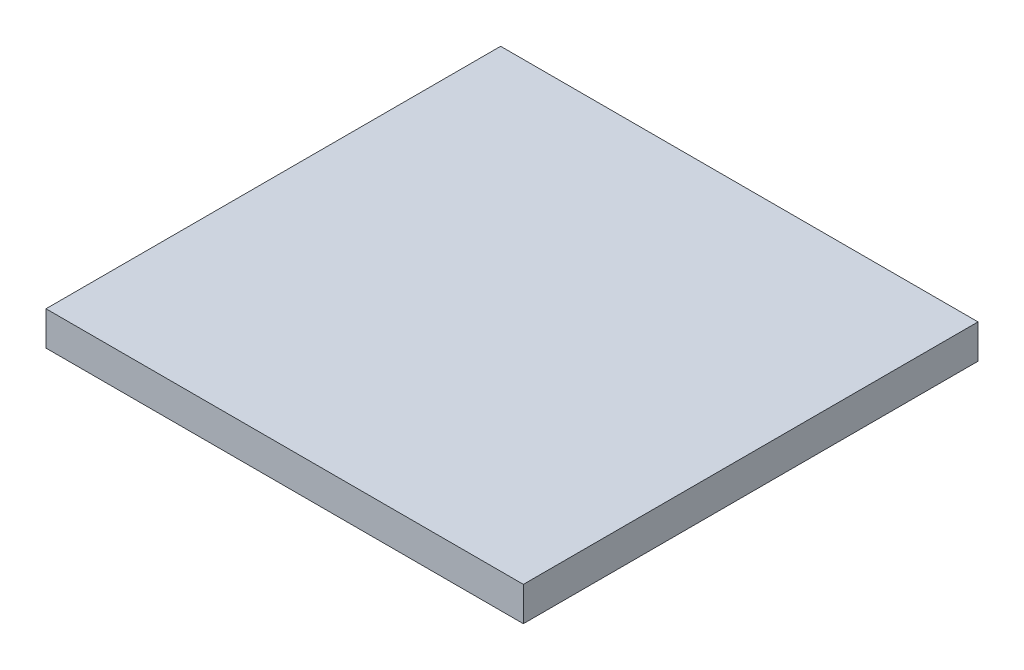
ISO-10303-21;
HEADER;
FILE_DESCRIPTION(('STEP AP214'),'2;1');
FILE_NAME('part.step','',(''),(''),'','','');
FILE_SCHEMA(('AUTOMOTIVE_DESIGN { 1 0 10303 214 1 1 1 1 }'));
ENDSEC;
DATA;
#1=APPLICATION_CONTEXT('core data for automotive mechanical design processes');
#2=APPLICATION_PROTOCOL_DEFINITION('international standard','automotive_design',2000,#1);
#3=PRODUCT_CONTEXT('',#1,'mechanical');
#4=PRODUCT('Part','Part','',(#3));
#5=PRODUCT_RELATED_PRODUCT_CATEGORY('part','',(#4));
#6=PRODUCT_DEFINITION_FORMATION('','',#4);
#7=PRODUCT_DEFINITION_CONTEXT('part definition',#1,'design');
#8=PRODUCT_DEFINITION('design','',#6,#7);
#9=PRODUCT_DEFINITION_SHAPE('','',#8);
#10=(LENGTH_UNIT() NAMED_UNIT(*) SI_UNIT(.MILLI.,.METRE.));
#11=(NAMED_UNIT(*) PLANE_ANGLE_UNIT() SI_UNIT($,.RADIAN.));
#12=(NAMED_UNIT(*) SI_UNIT($,.STERADIAN.) SOLID_ANGLE_UNIT());
#13=UNCERTAINTY_MEASURE_WITH_UNIT(LENGTH_MEASURE(1.E-05),#10,'distance_accuracy_value','');
#14=(GEOMETRIC_REPRESENTATION_CONTEXT(3) GLOBAL_UNCERTAINTY_ASSIGNED_CONTEXT((#13)) GLOBAL_UNIT_ASSIGNED_CONTEXT((#10,
#11,#12)) REPRESENTATION_CONTEXT('',''));
#15=CARTESIAN_POINT('',(0.,0.,0.));
#16=DIRECTION('',(0.,0.,1.));
#17=DIRECTION('',(1.,0.,0.));
#18=AXIS2_PLACEMENT_3D('',#15,#16,#17);
#19=CARTESIAN_POINT('',(133.35,9.525,-127.));
#20=DIRECTION('',(-1.,0.,0.));
#21=DIRECTION('',(0.,0.,1.));
#22=AXIS2_PLACEMENT_3D('',#19,#20,#21);
#23=PLANE('',#22);
#24=DIRECTION('',(0.,0.,-1.));
#25=VECTOR('',#24,1.);
#26=CARTESIAN_POINT('',(133.35,-9.525,-127.));
#27=LINE('',#26,#25);
#28=CARTESIAN_POINT('',(133.35,-9.525,127.));
#29=VERTEX_POINT('',#28);
#30=CARTESIAN_POINT('',(133.35,-9.525,-127.));
#31=VERTEX_POINT('',#30);
#32=EDGE_CURVE('E107',#29,#31,#27,.T.);
#33=ORIENTED_EDGE('',*,*,#32,.T.);
#34=DIRECTION('',(0.,-1.,0.));
#35=VECTOR('',#34,1.);
#36=CARTESIAN_POINT('',(133.35,9.525,-127.));
#37=LINE('',#36,#35);
#38=CARTESIAN_POINT('',(133.35,9.525,-127.));
#39=VERTEX_POINT('',#38);
#40=EDGE_CURVE('E11',#39,#31,#37,.T.);
#41=ORIENTED_EDGE('',*,*,#40,.F.);
#42=DIRECTION('',(0.,0.,-1.));
#43=VECTOR('',#42,1.);
#44=CARTESIAN_POINT('',(133.35,9.525,-127.));
#45=LINE('',#44,#43);
#46=CARTESIAN_POINT('',(133.35,9.525,127.));
#47=VERTEX_POINT('',#46);
#48=EDGE_CURVE('E91',#47,#39,#45,.T.);
#49=ORIENTED_EDGE('',*,*,#48,.F.);
#50=DIRECTION('',(0.,-1.,0.));
#51=VECTOR('',#50,1.);
#52=CARTESIAN_POINT('',(133.35,9.525,127.));
#53=LINE('',#52,#51);
#54=EDGE_CURVE('E103',#47,#29,#53,.T.);
#55=ORIENTED_EDGE('',*,*,#54,.T.);
#56=EDGE_LOOP('',(#33,#41,#49,#55));
#57=FACE_BOUND('',#56,.T.);
#58=ADVANCED_FACE('F39',(#57),#23,.F.);
#59=CARTESIAN_POINT('',(-133.35,9.525,-127.));
#60=DIRECTION('',(0.,0.,1.));
#61=DIRECTION('',(1.,0.,0.));
#62=AXIS2_PLACEMENT_3D('',#59,#60,#61);
#63=PLANE('',#62);
#64=DIRECTION('',(-1.,0.,0.));
#65=VECTOR('',#64,1.);
#66=CARTESIAN_POINT('',(-133.35,-9.525,-127.));
#67=LINE('',#66,#65);
#68=CARTESIAN_POINT('',(-133.35,-9.525,-127.));
#69=VERTEX_POINT('',#68);
#70=EDGE_CURVE('E96',#31,#69,#67,.T.);
#71=ORIENTED_EDGE('',*,*,#70,.T.);
#72=DIRECTION('',(0.,-1.,0.));
#73=VECTOR('',#72,1.);
#74=CARTESIAN_POINT('',(-133.35,9.525,-127.));
#75=LINE('',#74,#73);
#76=CARTESIAN_POINT('',(-133.35,9.525,-127.));
#77=VERTEX_POINT('',#76);
#78=EDGE_CURVE('E48',#77,#69,#75,.T.);
#79=ORIENTED_EDGE('',*,*,#78,.F.);
#80=DIRECTION('',(-1.,0.,0.));
#81=VECTOR('',#80,1.);
#82=CARTESIAN_POINT('',(-133.35,9.525,-127.));
#83=LINE('',#82,#81);
#84=EDGE_CURVE('E86',#39,#77,#83,.T.);
#85=ORIENTED_EDGE('',*,*,#84,.F.);
#86=ORIENTED_EDGE('',*,*,#40,.T.);
#87=EDGE_LOOP('',(#71,#79,#85,#86));
#88=FACE_BOUND('',#87,.T.);
#89=ADVANCED_FACE('F95',(#88),#63,.F.);
#90=CARTESIAN_POINT('',(-133.35,9.525,-127.));
#91=DIRECTION('',(1.,0.,0.));
#92=DIRECTION('',(0.,0.,-1.));
#93=AXIS2_PLACEMENT_3D('',#90,#91,#92);
#94=PLANE('',#93);
#95=DIRECTION('',(0.,0.,1.));
#96=VECTOR('',#95,1.);
#97=CARTESIAN_POINT('',(-133.35,-9.525,-127.));
#98=LINE('',#97,#96);
#99=CARTESIAN_POINT('',(-133.35,-9.525,127.));
#100=VERTEX_POINT('',#99);
#101=EDGE_CURVE('E73',#69,#100,#98,.T.);
#102=ORIENTED_EDGE('',*,*,#101,.T.);
#103=DIRECTION('',(0.,-1.,0.));
#104=VECTOR('',#103,1.);
#105=CARTESIAN_POINT('',(-133.35,9.525,127.));
#106=LINE('',#105,#104);
#107=CARTESIAN_POINT('',(-133.35,9.525,127.));
#108=VERTEX_POINT('',#107);
#109=EDGE_CURVE('E98',#108,#100,#106,.T.);
#110=ORIENTED_EDGE('',*,*,#109,.F.);
#111=DIRECTION('',(0.,0.,1.));
#112=VECTOR('',#111,1.);
#113=CARTESIAN_POINT('',(-133.35,9.525,-127.));
#114=LINE('',#113,#112);
#115=EDGE_CURVE('E89',#77,#108,#114,.T.);
#116=ORIENTED_EDGE('',*,*,#115,.F.);
#117=ORIENTED_EDGE('',*,*,#78,.T.);
#118=EDGE_LOOP('',(#102,#110,#116,#117));
#119=FACE_BOUND('',#118,.T.);
#120=ADVANCED_FACE('F99',(#119),#94,.F.);
#121=CARTESIAN_POINT('',(-133.35,9.525,127.));
#122=DIRECTION('',(0.,0.,-1.));
#123=DIRECTION('',(-1.,0.,0.));
#124=AXIS2_PLACEMENT_3D('',#121,#122,#123);
#125=PLANE('',#124);
#126=DIRECTION('',(1.,0.,0.));
#127=VECTOR('',#126,1.);
#128=CARTESIAN_POINT('',(-133.35,-9.525,127.));
#129=LINE('',#128,#127);
#130=EDGE_CURVE('E79',#100,#29,#129,.T.);
#131=ORIENTED_EDGE('',*,*,#130,.T.);
#132=ORIENTED_EDGE('',*,*,#54,.F.);
#133=DIRECTION('',(1.,0.,0.));
#134=VECTOR('',#133,1.);
#135=CARTESIAN_POINT('',(-133.35,9.525,127.));
#136=LINE('',#135,#134);
#137=EDGE_CURVE('E56',#108,#47,#136,.T.);
#138=ORIENTED_EDGE('',*,*,#137,.F.);
#139=ORIENTED_EDGE('',*,*,#109,.T.);
#140=EDGE_LOOP('',(#131,#132,#138,#139));
#141=FACE_BOUND('',#140,.T.);
#142=ADVANCED_FACE('F120',(#141),#125,.F.);
#143=CARTESIAN_POINT('',(0.,9.525,0.));
#144=DIRECTION('',(0.,1.,0.));
#145=DIRECTION('',(0.,0.,1.));
#146=AXIS2_PLACEMENT_3D('',#143,#144,#145);
#147=PLANE('',#146);
#148=ORIENTED_EDGE('',*,*,#48,.T.);
#149=ORIENTED_EDGE('',*,*,#84,.T.);
#150=ORIENTED_EDGE('',*,*,#115,.T.);
#151=ORIENTED_EDGE('',*,*,#137,.T.);
#152=EDGE_LOOP('',(#148,#149,#150,#151));
#153=FACE_BOUND('',#152,.T.);
#154=ADVANCED_FACE('F87',(#153),#147,.T.);
#155=CARTESIAN_POINT('',(0.,-9.525,0.));
#156=DIRECTION('',(0.,1.,0.));
#157=DIRECTION('',(0.,0.,1.));
#158=AXIS2_PLACEMENT_3D('',#155,#156,#157);
#159=PLANE('',#158);
#160=ORIENTED_EDGE('',*,*,#32,.F.);
#161=ORIENTED_EDGE('',*,*,#130,.F.);
#162=ORIENTED_EDGE('',*,*,#101,.F.);
#163=ORIENTED_EDGE('',*,*,#70,.F.);
#164=EDGE_LOOP('',(#160,#161,#162,#163));
#165=FACE_BOUND('',#164,.T.);
#166=ADVANCED_FACE('F123',(#165),#159,.F.);
#167=CLOSED_SHELL('',(#58,#89,#120,#142,#154,#166));
#168=MANIFOLD_SOLID_BREP('B2',#167);
#169=ADVANCED_BREP_SHAPE_REPRESENTATION('',(#18,#168),#14);
#170=SHAPE_DEFINITION_REPRESENTATION(#9,#169);
ENDSEC;
END-ISO-10303-21;
